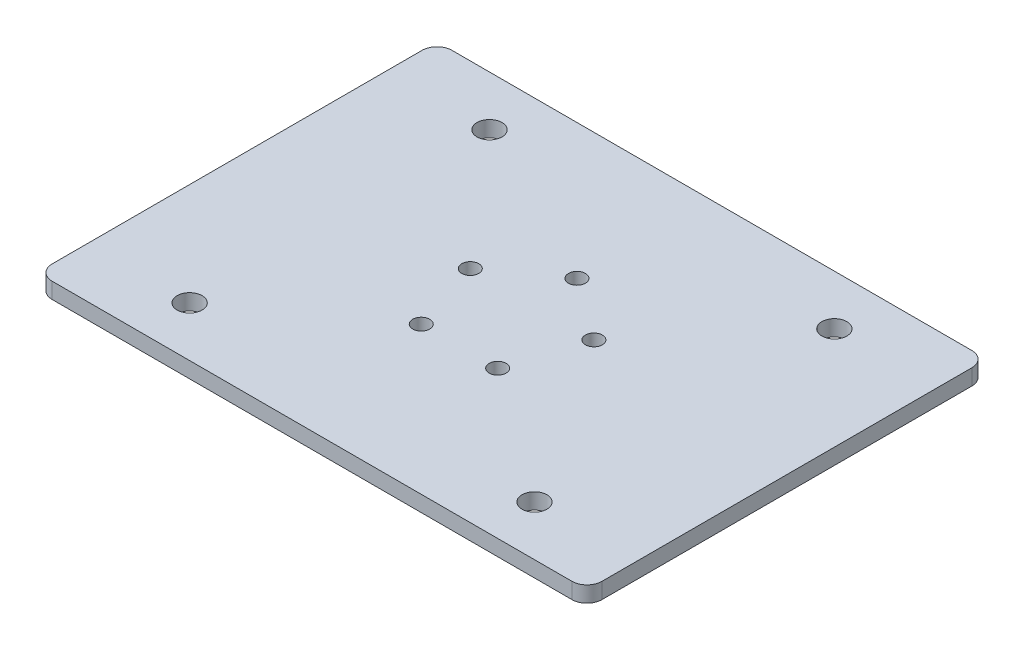
ISO-10303-21;
HEADER;
FILE_DESCRIPTION(('STEP AP214'),'2;1');
FILE_NAME('part.step','',(''),(''),'','','');
FILE_SCHEMA(('AUTOMOTIVE_DESIGN { 1 0 10303 214 1 1 1 1 }'));
ENDSEC;
DATA;
#1=APPLICATION_CONTEXT('core data for automotive mechanical design processes');
#2=APPLICATION_PROTOCOL_DEFINITION('international standard','automotive_design',2000,#1);
#3=PRODUCT_CONTEXT('',#1,'mechanical');
#4=PRODUCT('Part','Part','',(#3));
#5=PRODUCT_RELATED_PRODUCT_CATEGORY('part','',(#4));
#6=PRODUCT_DEFINITION_FORMATION('','',#4);
#7=PRODUCT_DEFINITION_CONTEXT('part definition',#1,'design');
#8=PRODUCT_DEFINITION('design','',#6,#7);
#9=PRODUCT_DEFINITION_SHAPE('','',#8);
#10=(LENGTH_UNIT() NAMED_UNIT(*) SI_UNIT(.MILLI.,.METRE.));
#11=(NAMED_UNIT(*) PLANE_ANGLE_UNIT() SI_UNIT($,.RADIAN.));
#12=(NAMED_UNIT(*) SI_UNIT($,.STERADIAN.) SOLID_ANGLE_UNIT());
#13=UNCERTAINTY_MEASURE_WITH_UNIT(LENGTH_MEASURE(1.E-05),#10,'distance_accuracy_value','');
#14=(GEOMETRIC_REPRESENTATION_CONTEXT(3) GLOBAL_UNCERTAINTY_ASSIGNED_CONTEXT((#13)) GLOBAL_UNIT_ASSIGNED_CONTEXT((#10,
#11,#12)) REPRESENTATION_CONTEXT('',''));
#15=CARTESIAN_POINT('',(0.,0.,0.));
#16=DIRECTION('',(0.,0.,1.));
#17=DIRECTION('',(1.,0.,0.));
#18=AXIS2_PLACEMENT_3D('',#15,#16,#17);
#19=CARTESIAN_POINT('',(52.,1.5875,-37.));
#20=DIRECTION('',(0.,-1.,0.));
#21=DIRECTION('',(0.,0.,-1.));
#22=AXIS2_PLACEMENT_3D('',#19,#20,#21);
#23=PLANE('',#22);
#24=CARTESIAN_POINT('',(0.,1.5875,-13.));
#25=DIRECTION('',(0.,1.,0.));
#26=DIRECTION('',(0.,0.,1.));
#27=AXIS2_PLACEMENT_3D('',#24,#25,#26);
#28=CIRCLE('',#27,1.7);
#29=CARTESIAN_POINT('',(0.,1.5875,-11.3));
#30=VERTEX_POINT('',#29);
#31=EDGE_CURVE('E186',#30,#30,#28,.T.);
#32=ORIENTED_EDGE('',*,*,#31,.F.);
#33=EDGE_LOOP('',(#32));
#34=FACE_BOUND('',#33,.T.);
#35=CARTESIAN_POINT('',(12.363734711837,1.5875,-4.01722092687432));
#36=DIRECTION('',(0.,1.,0.));
#37=DIRECTION('',(0.,0.,1.));
#38=AXIS2_PLACEMENT_3D('',#35,#36,#37);
#39=CIRCLE('',#38,1.7);
#40=CARTESIAN_POINT('',(12.363734711837,1.5875,-2.31722092687432));
#41=VERTEX_POINT('',#40);
#42=EDGE_CURVE('E176',#41,#41,#39,.T.);
#43=ORIENTED_EDGE('',*,*,#42,.F.);
#44=EDGE_LOOP('',(#43));
#45=FACE_BOUND('',#44,.T.);
#46=CARTESIAN_POINT('',(7.64120827980215,1.5875,10.5172209268743));
#47=DIRECTION('',(0.,1.,0.));
#48=DIRECTION('',(0.,0.,1.));
#49=AXIS2_PLACEMENT_3D('',#46,#47,#48);
#50=CIRCLE('',#49,1.7);
#51=CARTESIAN_POINT('',(7.64120827980215,1.5875,12.2172209268743));
#52=VERTEX_POINT('',#51);
#53=EDGE_CURVE('E173',#52,#52,#50,.T.);
#54=ORIENTED_EDGE('',*,*,#53,.F.);
#55=EDGE_LOOP('',(#54));
#56=FACE_BOUND('',#55,.T.);
#57=CARTESIAN_POINT('',(-7.64120827980215,1.5875,10.5172209268743));
#58=DIRECTION('',(0.,1.,0.));
#59=DIRECTION('',(0.,0.,1.));
#60=AXIS2_PLACEMENT_3D('',#57,#58,#59);
#61=CIRCLE('',#60,1.7);
#62=CARTESIAN_POINT('',(-7.64120827980215,1.5875,12.2172209268743));
#63=VERTEX_POINT('',#62);
#64=EDGE_CURVE('E172',#63,#63,#61,.T.);
#65=ORIENTED_EDGE('',*,*,#64,.F.);
#66=EDGE_LOOP('',(#65));
#67=FACE_BOUND('',#66,.T.);
#68=CARTESIAN_POINT('',(-12.363734711837,1.5875,-4.01722092687432));
#69=DIRECTION('',(0.,1.,0.));
#70=DIRECTION('',(0.,0.,1.));
#71=AXIS2_PLACEMENT_3D('',#68,#69,#70);
#72=CIRCLE('',#71,1.7);
#73=CARTESIAN_POINT('',(-12.363734711837,1.5875,-2.31722092687432));
#74=VERTEX_POINT('',#73);
#75=EDGE_CURVE('E169',#74,#74,#72,.T.);
#76=ORIENTED_EDGE('',*,*,#75,.F.);
#77=EDGE_LOOP('',(#76));
#78=FACE_BOUND('',#77,.T.);
#79=CARTESIAN_POINT('',(-34.5,1.5875,30.));
#80=DIRECTION('',(0.,1.,0.));
#81=DIRECTION('',(0.,0.,1.));
#82=AXIS2_PLACEMENT_3D('',#79,#80,#81);
#83=CIRCLE('',#82,2.5);
#84=CARTESIAN_POINT('',(-34.5,1.5875,32.5));
#85=VERTEX_POINT('',#84);
#86=EDGE_CURVE('E202',#85,#85,#83,.T.);
#87=ORIENTED_EDGE('',*,*,#86,.F.);
#88=EDGE_LOOP('',(#87));
#89=FACE_BOUND('',#88,.T.);
#90=CARTESIAN_POINT('',(34.5,1.5875,-30.));
#91=DIRECTION('',(0.,1.,0.));
#92=DIRECTION('',(0.,0.,1.));
#93=AXIS2_PLACEMENT_3D('',#90,#91,#92);
#94=CIRCLE('',#93,2.49999999999999);
#95=CARTESIAN_POINT('',(34.5,1.5875,-27.5));
#96=VERTEX_POINT('',#95);
#97=EDGE_CURVE('E142',#96,#96,#94,.T.);
#98=ORIENTED_EDGE('',*,*,#97,.F.);
#99=EDGE_LOOP('',(#98));
#100=FACE_BOUND('',#99,.T.);
#101=CARTESIAN_POINT('',(52.,1.5875,-37.));
#102=DIRECTION('',(0.,1.,0.));
#103=DIRECTION('',(0.,0.,-1.));
#104=AXIS2_PLACEMENT_3D('',#101,#102,#103);
#105=CIRCLE('',#104,3.);
#106=CARTESIAN_POINT('',(55.,1.5875,-37.));
#107=VERTEX_POINT('',#106);
#108=CARTESIAN_POINT('',(52.,1.5875,-40.));
#109=VERTEX_POINT('',#108);
#110=EDGE_CURVE('E153',#107,#109,#105,.T.);
#111=ORIENTED_EDGE('',*,*,#110,.T.);
#112=DIRECTION('',(-1.,0.,0.));
#113=VECTOR('',#112,1.);
#114=CARTESIAN_POINT('',(52.,1.5875,-40.));
#115=LINE('',#114,#113);
#116=CARTESIAN_POINT('',(-52.,1.5875,-40.));
#117=VERTEX_POINT('',#116);
#118=EDGE_CURVE('E101',#109,#117,#115,.T.);
#119=ORIENTED_EDGE('',*,*,#118,.T.);
#120=CARTESIAN_POINT('',(-52.,1.5875,-37.));
#121=DIRECTION('',(0.,1.,0.));
#122=DIRECTION('',(0.,0.,1.));
#123=AXIS2_PLACEMENT_3D('',#120,#121,#122);
#124=CIRCLE('',#123,3.00000000000001);
#125=CARTESIAN_POINT('',(-55.,1.5875,-37.));
#126=VERTEX_POINT('',#125);
#127=EDGE_CURVE('E220',#117,#126,#124,.T.);
#128=ORIENTED_EDGE('',*,*,#127,.T.);
#129=DIRECTION('',(0.,0.,1.));
#130=VECTOR('',#129,1.);
#131=CARTESIAN_POINT('',(-55.,1.5875,-37.));
#132=LINE('',#131,#130);
#133=CARTESIAN_POINT('',(-55.,1.5875,37.));
#134=VERTEX_POINT('',#133);
#135=EDGE_CURVE('E222',#126,#134,#132,.T.);
#136=ORIENTED_EDGE('',*,*,#135,.T.);
#137=CARTESIAN_POINT('',(-52.,1.5875,37.));
#138=DIRECTION('',(0.,1.,0.));
#139=DIRECTION('',(0.,0.,-1.));
#140=AXIS2_PLACEMENT_3D('',#137,#138,#139);
#141=CIRCLE('',#140,3.);
#142=CARTESIAN_POINT('',(-52.,1.5875,40.));
#143=VERTEX_POINT('',#142);
#144=EDGE_CURVE('E120',#134,#143,#141,.T.);
#145=ORIENTED_EDGE('',*,*,#144,.T.);
#146=DIRECTION('',(1.,0.,0.));
#147=VECTOR('',#146,1.);
#148=CARTESIAN_POINT('',(52.,1.5875,40.));
#149=LINE('',#148,#147);
#150=CARTESIAN_POINT('',(52.,1.5875,40.));
#151=VERTEX_POINT('',#150);
#152=EDGE_CURVE('E114',#143,#151,#149,.T.);
#153=ORIENTED_EDGE('',*,*,#152,.T.);
#154=CARTESIAN_POINT('',(52.,1.5875,37.));
#155=DIRECTION('',(0.,1.,0.));
#156=DIRECTION('',(0.,0.,-1.));
#157=AXIS2_PLACEMENT_3D('',#154,#155,#156);
#158=CIRCLE('',#157,3.00000000000001);
#159=CARTESIAN_POINT('',(55.,1.5875,37.));
#160=VERTEX_POINT('',#159);
#161=EDGE_CURVE('E118',#151,#160,#158,.T.);
#162=ORIENTED_EDGE('',*,*,#161,.T.);
#163=DIRECTION('',(0.,0.,-1.));
#164=VECTOR('',#163,1.);
#165=CARTESIAN_POINT('',(55.,1.5875,-37.));
#166=LINE('',#165,#164);
#167=EDGE_CURVE('E58',#160,#107,#166,.T.);
#168=ORIENTED_EDGE('',*,*,#167,.T.);
#169=EDGE_LOOP('',(#111,#119,#128,#136,#145,#153,#162,#168));
#170=FACE_BOUND('',#169,.T.);
#171=CARTESIAN_POINT('',(34.5,1.5875,30.));
#172=DIRECTION('',(0.,1.,0.));
#173=DIRECTION('',(0.,0.,1.));
#174=AXIS2_PLACEMENT_3D('',#171,#172,#173);
#175=CIRCLE('',#174,2.50000000000001);
#176=CARTESIAN_POINT('',(34.5,1.5875,32.5));
#177=VERTEX_POINT('',#176);
#178=EDGE_CURVE('E208',#177,#177,#175,.T.);
#179=ORIENTED_EDGE('',*,*,#178,.F.);
#180=EDGE_LOOP('',(#179));
#181=FACE_BOUND('',#180,.T.);
#182=CARTESIAN_POINT('',(-34.5,1.5875,-30.));
#183=DIRECTION('',(0.,1.,0.));
#184=DIRECTION('',(0.,0.,1.));
#185=AXIS2_PLACEMENT_3D('',#182,#183,#184);
#186=CIRCLE('',#185,2.5);
#187=CARTESIAN_POINT('',(-34.5,1.5875,-27.5));
#188=VERTEX_POINT('',#187);
#189=EDGE_CURVE('E196',#188,#188,#186,.T.);
#190=ORIENTED_EDGE('',*,*,#189,.F.);
#191=EDGE_LOOP('',(#190));
#192=FACE_BOUND('',#191,.T.);
#193=ADVANCED_FACE('F39',(#34,#45,#56,#67,#78,#89,#100,#170,#181,#192),#23,.F.);
#194=CARTESIAN_POINT('',(52.,-1.5875,-37.));
#195=DIRECTION('',(0.,-1.,0.));
#196=DIRECTION('',(0.,0.,-1.));
#197=AXIS2_PLACEMENT_3D('',#194,#195,#196);
#198=PLANE('',#197);
#199=CARTESIAN_POINT('',(0.,-1.5875,-13.));
#200=DIRECTION('',(0.,-1.,0.));
#201=DIRECTION('',(0.,0.,-1.));
#202=AXIS2_PLACEMENT_3D('',#199,#200,#201);
#203=CIRCLE('',#202,1.7);
#204=CARTESIAN_POINT('',(0.,-1.5875,-14.7));
#205=VERTEX_POINT('',#204);
#206=EDGE_CURVE('E43',#205,#205,#203,.T.);
#207=ORIENTED_EDGE('',*,*,#206,.F.);
#208=EDGE_LOOP('',(#207));
#209=FACE_BOUND('',#208,.T.);
#210=CARTESIAN_POINT('',(12.363734711837,-1.5875,-4.01722092687432));
#211=DIRECTION('',(0.,-1.,0.));
#212=DIRECTION('',(0.,0.,-1.));
#213=AXIS2_PLACEMENT_3D('',#210,#211,#212);
#214=CIRCLE('',#213,1.7);
#215=CARTESIAN_POINT('',(12.363734711837,-1.5875,-5.71722092687431));
#216=VERTEX_POINT('',#215);
#217=EDGE_CURVE('E174',#216,#216,#214,.T.);
#218=ORIENTED_EDGE('',*,*,#217,.F.);
#219=EDGE_LOOP('',(#218));
#220=FACE_BOUND('',#219,.T.);
#221=CARTESIAN_POINT('',(7.64120827980215,-1.5875,10.5172209268743));
#222=DIRECTION('',(0.,-1.,0.));
#223=DIRECTION('',(0.,0.,-1.));
#224=AXIS2_PLACEMENT_3D('',#221,#222,#223);
#225=CIRCLE('',#224,1.7);
#226=CARTESIAN_POINT('',(7.64120827980215,-1.5875,8.81722092687432));
#227=VERTEX_POINT('',#226);
#228=EDGE_CURVE('E170',#227,#227,#225,.T.);
#229=ORIENTED_EDGE('',*,*,#228,.F.);
#230=EDGE_LOOP('',(#229));
#231=FACE_BOUND('',#230,.T.);
#232=CARTESIAN_POINT('',(-7.64120827980215,-1.5875,10.5172209268743));
#233=DIRECTION('',(0.,-1.,0.));
#234=DIRECTION('',(0.,0.,-1.));
#235=AXIS2_PLACEMENT_3D('',#232,#233,#234);
#236=CIRCLE('',#235,1.7);
#237=CARTESIAN_POINT('',(-7.64120827980215,-1.5875,8.81722092687432));
#238=VERTEX_POINT('',#237);
#239=EDGE_CURVE('E191',#238,#238,#236,.T.);
#240=ORIENTED_EDGE('',*,*,#239,.F.);
#241=EDGE_LOOP('',(#240));
#242=FACE_BOUND('',#241,.T.);
#243=CARTESIAN_POINT('',(-12.363734711837,-1.5875,-4.01722092687432));
#244=DIRECTION('',(0.,-1.,0.));
#245=DIRECTION('',(0.,0.,-1.));
#246=AXIS2_PLACEMENT_3D('',#243,#244,#245);
#247=CIRCLE('',#246,1.7);
#248=CARTESIAN_POINT('',(-12.363734711837,-1.5875,-5.71722092687432));
#249=VERTEX_POINT('',#248);
#250=EDGE_CURVE('E165',#249,#249,#247,.T.);
#251=ORIENTED_EDGE('',*,*,#250,.F.);
#252=EDGE_LOOP('',(#251));
#253=FACE_BOUND('',#252,.T.);
#254=CARTESIAN_POINT('',(-34.5,-1.5875,30.));
#255=DIRECTION('',(0.,1.,0.));
#256=DIRECTION('',(0.,0.,1.));
#257=AXIS2_PLACEMENT_3D('',#254,#255,#256);
#258=CIRCLE('',#257,2.5);
#259=CARTESIAN_POINT('',(-34.5,-1.5875,32.5));
#260=VERTEX_POINT('',#259);
#261=EDGE_CURVE('E199',#260,#260,#258,.T.);
#262=ORIENTED_EDGE('',*,*,#261,.T.);
#263=EDGE_LOOP('',(#262));
#264=FACE_BOUND('',#263,.T.);
#265=CARTESIAN_POINT('',(34.5,-1.5875,-30.));
#266=DIRECTION('',(0.,1.,0.));
#267=DIRECTION('',(0.,0.,1.));
#268=AXIS2_PLACEMENT_3D('',#265,#266,#267);
#269=CIRCLE('',#268,2.49999999999999);
#270=CARTESIAN_POINT('',(34.5,-1.5875,-27.5));
#271=VERTEX_POINT('',#270);
#272=EDGE_CURVE('E211',#271,#271,#269,.T.);
#273=ORIENTED_EDGE('',*,*,#272,.T.);
#274=EDGE_LOOP('',(#273));
#275=FACE_BOUND('',#274,.T.);
#276=CARTESIAN_POINT('',(52.,-1.5875,-37.));
#277=DIRECTION('',(0.,1.,0.));
#278=DIRECTION('',(0.,0.,-1.));
#279=AXIS2_PLACEMENT_3D('',#276,#277,#278);
#280=CIRCLE('',#279,3.);
#281=CARTESIAN_POINT('',(55.,-1.5875,-37.));
#282=VERTEX_POINT('',#281);
#283=CARTESIAN_POINT('',(52.,-1.5875,-40.));
#284=VERTEX_POINT('',#283);
#285=EDGE_CURVE('E138',#282,#284,#280,.T.);
#286=ORIENTED_EDGE('',*,*,#285,.F.);
#287=DIRECTION('',(0.,0.,-1.));
#288=VECTOR('',#287,1.);
#289=CARTESIAN_POINT('',(55.,-1.5875,-37.));
#290=LINE('',#289,#288);
#291=CARTESIAN_POINT('',(55.,-1.5875,37.));
#292=VERTEX_POINT('',#291);
#293=EDGE_CURVE('E93',#292,#282,#290,.T.);
#294=ORIENTED_EDGE('',*,*,#293,.F.);
#295=CARTESIAN_POINT('',(52.,-1.5875,37.));
#296=DIRECTION('',(0.,1.,0.));
#297=DIRECTION('',(0.,0.,-1.));
#298=AXIS2_PLACEMENT_3D('',#295,#296,#297);
#299=CIRCLE('',#298,3.00000000000001);
#300=CARTESIAN_POINT('',(52.,-1.5875,40.));
#301=VERTEX_POINT('',#300);
#302=EDGE_CURVE('E87',#301,#292,#299,.T.);
#303=ORIENTED_EDGE('',*,*,#302,.F.);
#304=DIRECTION('',(1.,0.,0.));
#305=VECTOR('',#304,1.);
#306=CARTESIAN_POINT('',(52.,-1.5875,40.));
#307=LINE('',#306,#305);
#308=CARTESIAN_POINT('',(-52.,-1.5875,40.));
#309=VERTEX_POINT('',#308);
#310=EDGE_CURVE('E128',#309,#301,#307,.T.);
#311=ORIENTED_EDGE('',*,*,#310,.F.);
#312=CARTESIAN_POINT('',(-52.,-1.5875,37.));
#313=DIRECTION('',(0.,1.,0.));
#314=DIRECTION('',(0.,0.,-1.));
#315=AXIS2_PLACEMENT_3D('',#312,#313,#314);
#316=CIRCLE('',#315,3.);
#317=CARTESIAN_POINT('',(-55.,-1.5875,37.));
#318=VERTEX_POINT('',#317);
#319=EDGE_CURVE('E148',#318,#309,#316,.T.);
#320=ORIENTED_EDGE('',*,*,#319,.F.);
#321=DIRECTION('',(0.,0.,1.));
#322=VECTOR('',#321,1.);
#323=CARTESIAN_POINT('',(-55.,-1.5875,-37.));
#324=LINE('',#323,#322);
#325=CARTESIAN_POINT('',(-55.,-1.5875,-37.));
#326=VERTEX_POINT('',#325);
#327=EDGE_CURVE('E146',#326,#318,#324,.T.);
#328=ORIENTED_EDGE('',*,*,#327,.F.);
#329=CARTESIAN_POINT('',(-52.,-1.5875,-37.));
#330=DIRECTION('',(0.,1.,0.));
#331=DIRECTION('',(0.,0.,1.));
#332=AXIS2_PLACEMENT_3D('',#329,#330,#331);
#333=CIRCLE('',#332,3.00000000000001);
#334=CARTESIAN_POINT('',(-52.,-1.5875,-40.));
#335=VERTEX_POINT('',#334);
#336=EDGE_CURVE('E144',#335,#326,#333,.T.);
#337=ORIENTED_EDGE('',*,*,#336,.F.);
#338=DIRECTION('',(-1.,0.,0.));
#339=VECTOR('',#338,1.);
#340=CARTESIAN_POINT('',(52.,-1.5875,-40.));
#341=LINE('',#340,#339);
#342=EDGE_CURVE('E141',#284,#335,#341,.T.);
#343=ORIENTED_EDGE('',*,*,#342,.F.);
#344=EDGE_LOOP('',(#286,#294,#303,#311,#320,#328,#337,#343));
#345=FACE_BOUND('',#344,.T.);
#346=CARTESIAN_POINT('',(34.5,-1.5875,30.));
#347=DIRECTION('',(0.,1.,0.));
#348=DIRECTION('',(0.,0.,1.));
#349=AXIS2_PLACEMENT_3D('',#346,#347,#348);
#350=CIRCLE('',#349,2.50000000000001);
#351=CARTESIAN_POINT('',(34.5,-1.5875,32.5));
#352=VERTEX_POINT('',#351);
#353=EDGE_CURVE('E205',#352,#352,#350,.T.);
#354=ORIENTED_EDGE('',*,*,#353,.T.);
#355=EDGE_LOOP('',(#354));
#356=FACE_BOUND('',#355,.T.);
#357=CARTESIAN_POINT('',(-34.5,-1.5875,-30.));
#358=DIRECTION('',(0.,1.,0.));
#359=DIRECTION('',(0.,0.,1.));
#360=AXIS2_PLACEMENT_3D('',#357,#358,#359);
#361=CIRCLE('',#360,2.5);
#362=CARTESIAN_POINT('',(-34.5,-1.5875,-27.5));
#363=VERTEX_POINT('',#362);
#364=EDGE_CURVE('E168',#363,#363,#361,.T.);
#365=ORIENTED_EDGE('',*,*,#364,.T.);
#366=EDGE_LOOP('',(#365));
#367=FACE_BOUND('',#366,.T.);
#368=ADVANCED_FACE('F235',(#209,#220,#231,#242,#253,#264,#275,#345,#356,#367),#198,.T.);
#369=CARTESIAN_POINT('',(52.,1.5875,-37.));
#370=DIRECTION('',(0.,-1.,0.));
#371=DIRECTION('',(0.,0.,-1.));
#372=AXIS2_PLACEMENT_3D('',#369,#370,#371);
#373=CYLINDRICAL_SURFACE('',#372,3.);
#374=ORIENTED_EDGE('',*,*,#285,.T.);
#375=DIRECTION('',(0.,-1.,0.));
#376=VECTOR('',#375,1.);
#377=CARTESIAN_POINT('',(52.,1.5875,-40.));
#378=LINE('',#377,#376);
#379=EDGE_CURVE('E11',#109,#284,#378,.T.);
#380=ORIENTED_EDGE('',*,*,#379,.F.);
#381=ORIENTED_EDGE('',*,*,#110,.F.);
#382=DIRECTION('',(0.,-1.,0.));
#383=VECTOR('',#382,1.);
#384=CARTESIAN_POINT('',(55.,1.5875,-37.));
#385=LINE('',#384,#383);
#386=EDGE_CURVE('E134',#107,#282,#385,.T.);
#387=ORIENTED_EDGE('',*,*,#386,.T.);
#388=EDGE_LOOP('',(#374,#380,#381,#387));
#389=FACE_BOUND('',#388,.T.);
#390=ADVANCED_FACE('F41',(#389),#373,.T.);
#391=CARTESIAN_POINT('',(52.,1.5875,-40.));
#392=DIRECTION('',(0.,0.,1.));
#393=DIRECTION('',(1.,0.,0.));
#394=AXIS2_PLACEMENT_3D('',#391,#392,#393);
#395=PLANE('',#394);
#396=ORIENTED_EDGE('',*,*,#342,.T.);
#397=DIRECTION('',(0.,-1.,0.));
#398=VECTOR('',#397,1.);
#399=CARTESIAN_POINT('',(-52.,1.5875,-40.));
#400=LINE('',#399,#398);
#401=EDGE_CURVE('E49',#117,#335,#400,.T.);
#402=ORIENTED_EDGE('',*,*,#401,.F.);
#403=ORIENTED_EDGE('',*,*,#118,.F.);
#404=ORIENTED_EDGE('',*,*,#379,.T.);
#405=EDGE_LOOP('',(#396,#402,#403,#404));
#406=FACE_BOUND('',#405,.T.);
#407=ADVANCED_FACE('F354',(#406),#395,.F.);
#408=CARTESIAN_POINT('',(-52.,1.5875,-37.));
#409=DIRECTION('',(0.,-1.,0.));
#410=DIRECTION('',(0.,0.,-1.));
#411=AXIS2_PLACEMENT_3D('',#408,#409,#410);
#412=CYLINDRICAL_SURFACE('',#411,3.00000000000001);
#413=ORIENTED_EDGE('',*,*,#336,.T.);
#414=DIRECTION('',(0.,-1.,0.));
#415=VECTOR('',#414,1.);
#416=CARTESIAN_POINT('',(-55.,1.5875,-37.));
#417=LINE('',#416,#415);
#418=EDGE_CURVE('E160',#126,#326,#417,.T.);
#419=ORIENTED_EDGE('',*,*,#418,.F.);
#420=ORIENTED_EDGE('',*,*,#127,.F.);
#421=ORIENTED_EDGE('',*,*,#401,.T.);
#422=EDGE_LOOP('',(#413,#419,#420,#421));
#423=FACE_BOUND('',#422,.T.);
#424=ADVANCED_FACE('F360',(#423),#412,.T.);
#425=CARTESIAN_POINT('',(-55.,1.5875,-37.));
#426=DIRECTION('',(1.,0.,0.));
#427=DIRECTION('',(0.,0.,-1.));
#428=AXIS2_PLACEMENT_3D('',#425,#426,#427);
#429=PLANE('',#428);
#430=ORIENTED_EDGE('',*,*,#327,.T.);
#431=DIRECTION('',(0.,-1.,0.));
#432=VECTOR('',#431,1.);
#433=CARTESIAN_POINT('',(-55.,1.5875,37.));
#434=LINE('',#433,#432);
#435=EDGE_CURVE('E157',#134,#318,#434,.T.);
#436=ORIENTED_EDGE('',*,*,#435,.F.);
#437=ORIENTED_EDGE('',*,*,#135,.F.);
#438=ORIENTED_EDGE('',*,*,#418,.T.);
#439=EDGE_LOOP('',(#430,#436,#437,#438));
#440=FACE_BOUND('',#439,.T.);
#441=ADVANCED_FACE('F228',(#440),#429,.F.);
#442=CARTESIAN_POINT('',(-52.,1.5875,37.));
#443=DIRECTION('',(0.,-1.,0.));
#444=DIRECTION('',(0.,0.,-1.));
#445=AXIS2_PLACEMENT_3D('',#442,#443,#444);
#446=CYLINDRICAL_SURFACE('',#445,3.);
#447=ORIENTED_EDGE('',*,*,#319,.T.);
#448=DIRECTION('',(0.,-1.,0.));
#449=VECTOR('',#448,1.);
#450=CARTESIAN_POINT('',(-52.,1.5875,40.));
#451=LINE('',#450,#449);
#452=EDGE_CURVE('E129',#143,#309,#451,.T.);
#453=ORIENTED_EDGE('',*,*,#452,.F.);
#454=ORIENTED_EDGE('',*,*,#144,.F.);
#455=ORIENTED_EDGE('',*,*,#435,.T.);
#456=EDGE_LOOP('',(#447,#453,#454,#455));
#457=FACE_BOUND('',#456,.T.);
#458=ADVANCED_FACE('F232',(#457),#446,.T.);
#459=CARTESIAN_POINT('',(52.,1.5875,40.));
#460=DIRECTION('',(0.,0.,-1.));
#461=DIRECTION('',(-1.,0.,0.));
#462=AXIS2_PLACEMENT_3D('',#459,#460,#461);
#463=PLANE('',#462);
#464=ORIENTED_EDGE('',*,*,#310,.T.);
#465=DIRECTION('',(0.,-1.,0.));
#466=VECTOR('',#465,1.);
#467=CARTESIAN_POINT('',(52.,1.5875,40.));
#468=LINE('',#467,#466);
#469=EDGE_CURVE('E125',#151,#301,#468,.T.);
#470=ORIENTED_EDGE('',*,*,#469,.F.);
#471=ORIENTED_EDGE('',*,*,#152,.F.);
#472=ORIENTED_EDGE('',*,*,#452,.T.);
#473=EDGE_LOOP('',(#464,#470,#471,#472));
#474=FACE_BOUND('',#473,.T.);
#475=ADVANCED_FACE('F126',(#474),#463,.F.);
#476=CARTESIAN_POINT('',(52.,1.5875,37.));
#477=DIRECTION('',(0.,-1.,0.));
#478=DIRECTION('',(0.,0.,-1.));
#479=AXIS2_PLACEMENT_3D('',#476,#477,#478);
#480=CYLINDRICAL_SURFACE('',#479,3.00000000000001);
#481=ORIENTED_EDGE('',*,*,#302,.T.);
#482=DIRECTION('',(0.,-1.,0.));
#483=VECTOR('',#482,1.);
#484=CARTESIAN_POINT('',(55.,1.5875,37.));
#485=LINE('',#484,#483);
#486=EDGE_CURVE('E130',#160,#292,#485,.T.);
#487=ORIENTED_EDGE('',*,*,#486,.F.);
#488=ORIENTED_EDGE('',*,*,#161,.F.);
#489=ORIENTED_EDGE('',*,*,#469,.T.);
#490=EDGE_LOOP('',(#481,#487,#488,#489));
#491=FACE_BOUND('',#490,.T.);
#492=ADVANCED_FACE('F132',(#491),#480,.T.);
#493=CARTESIAN_POINT('',(55.,1.5875,-37.));
#494=DIRECTION('',(-1.,0.,0.));
#495=DIRECTION('',(0.,0.,1.));
#496=AXIS2_PLACEMENT_3D('',#493,#494,#495);
#497=PLANE('',#496);
#498=ORIENTED_EDGE('',*,*,#293,.T.);
#499=ORIENTED_EDGE('',*,*,#386,.F.);
#500=ORIENTED_EDGE('',*,*,#167,.F.);
#501=ORIENTED_EDGE('',*,*,#486,.T.);
#502=EDGE_LOOP('',(#498,#499,#500,#501));
#503=FACE_BOUND('',#502,.T.);
#504=ADVANCED_FACE('F241',(#503),#497,.F.);
#505=CARTESIAN_POINT('',(34.5,1.5875,-30.));
#506=DIRECTION('',(0.,-1.,0.));
#507=DIRECTION('',(0.,0.,-1.));
#508=AXIS2_PLACEMENT_3D('',#505,#506,#507);
#509=CYLINDRICAL_SURFACE('',#508,2.49999999999999);
#510=ORIENTED_EDGE('',*,*,#97,.T.);
#511=EDGE_LOOP('',(#510));
#512=FACE_BOUND('',#511,.T.);
#513=ORIENTED_EDGE('',*,*,#272,.F.);
#514=EDGE_LOOP('',(#513));
#515=FACE_BOUND('',#514,.T.);
#516=ADVANCED_FACE('F243',(#512,#515),#509,.F.);
#517=CARTESIAN_POINT('',(34.5,1.5875,30.));
#518=DIRECTION('',(0.,-1.,0.));
#519=DIRECTION('',(0.,0.,-1.));
#520=AXIS2_PLACEMENT_3D('',#517,#518,#519);
#521=CYLINDRICAL_SURFACE('',#520,2.50000000000001);
#522=ORIENTED_EDGE('',*,*,#178,.T.);
#523=EDGE_LOOP('',(#522));
#524=FACE_BOUND('',#523,.T.);
#525=ORIENTED_EDGE('',*,*,#353,.F.);
#526=EDGE_LOOP('',(#525));
#527=FACE_BOUND('',#526,.T.);
#528=ADVANCED_FACE('F249',(#524,#527),#521,.F.);
#529=CARTESIAN_POINT('',(-34.5,1.5875,30.));
#530=DIRECTION('',(0.,-1.,0.));
#531=DIRECTION('',(0.,0.,-1.));
#532=AXIS2_PLACEMENT_3D('',#529,#530,#531);
#533=CYLINDRICAL_SURFACE('',#532,2.5);
#534=ORIENTED_EDGE('',*,*,#86,.T.);
#535=EDGE_LOOP('',(#534));
#536=FACE_BOUND('',#535,.T.);
#537=ORIENTED_EDGE('',*,*,#261,.F.);
#538=EDGE_LOOP('',(#537));
#539=FACE_BOUND('',#538,.T.);
#540=ADVANCED_FACE('F267',(#536,#539),#533,.F.);
#541=CARTESIAN_POINT('',(-34.5,1.5875,-30.));
#542=DIRECTION('',(0.,-1.,0.));
#543=DIRECTION('',(0.,0.,-1.));
#544=AXIS2_PLACEMENT_3D('',#541,#542,#543);
#545=CYLINDRICAL_SURFACE('',#544,2.5);
#546=ORIENTED_EDGE('',*,*,#189,.T.);
#547=EDGE_LOOP('',(#546));
#548=FACE_BOUND('',#547,.T.);
#549=ORIENTED_EDGE('',*,*,#364,.F.);
#550=EDGE_LOOP('',(#549));
#551=FACE_BOUND('',#550,.T.);
#552=ADVANCED_FACE('F271',(#548,#551),#545,.F.);
#553=CARTESIAN_POINT('',(-12.363734711837,1.5875,-4.01722092687432));
#554=DIRECTION('',(0.,1.,0.));
#555=DIRECTION('',(0.,0.,1.));
#556=AXIS2_PLACEMENT_3D('',#553,#554,#555);
#557=CYLINDRICAL_SURFACE('',#556,1.7);
#558=ORIENTED_EDGE('',*,*,#250,.T.);
#559=EDGE_LOOP('',(#558));
#560=FACE_BOUND('',#559,.T.);
#561=ORIENTED_EDGE('',*,*,#75,.T.);
#562=EDGE_LOOP('',(#561));
#563=FACE_BOUND('',#562,.T.);
#564=ADVANCED_FACE('F274',(#560,#563),#557,.F.);
#565=CARTESIAN_POINT('',(-7.64120827980215,1.5875,10.5172209268743));
#566=DIRECTION('',(0.,1.,0.));
#567=DIRECTION('',(0.,0.,1.));
#568=AXIS2_PLACEMENT_3D('',#565,#566,#567);
#569=CYLINDRICAL_SURFACE('',#568,1.7);
#570=ORIENTED_EDGE('',*,*,#239,.T.);
#571=EDGE_LOOP('',(#570));
#572=FACE_BOUND('',#571,.T.);
#573=ORIENTED_EDGE('',*,*,#64,.T.);
#574=EDGE_LOOP('',(#573));
#575=FACE_BOUND('',#574,.T.);
#576=ADVANCED_FACE('F278',(#572,#575),#569,.F.);
#577=CARTESIAN_POINT('',(7.64120827980215,1.5875,10.5172209268743));
#578=DIRECTION('',(0.,1.,0.));
#579=DIRECTION('',(0.,0.,1.));
#580=AXIS2_PLACEMENT_3D('',#577,#578,#579);
#581=CYLINDRICAL_SURFACE('',#580,1.7);
#582=ORIENTED_EDGE('',*,*,#228,.T.);
#583=EDGE_LOOP('',(#582));
#584=FACE_BOUND('',#583,.T.);
#585=ORIENTED_EDGE('',*,*,#53,.T.);
#586=EDGE_LOOP('',(#585));
#587=FACE_BOUND('',#586,.T.);
#588=ADVANCED_FACE('F282',(#584,#587),#581,.F.);
#589=CARTESIAN_POINT('',(12.363734711837,1.5875,-4.01722092687432));
#590=DIRECTION('',(0.,1.,0.));
#591=DIRECTION('',(0.,0.,1.));
#592=AXIS2_PLACEMENT_3D('',#589,#590,#591);
#593=CYLINDRICAL_SURFACE('',#592,1.7);
#594=ORIENTED_EDGE('',*,*,#217,.T.);
#595=EDGE_LOOP('',(#594));
#596=FACE_BOUND('',#595,.T.);
#597=ORIENTED_EDGE('',*,*,#42,.T.);
#598=EDGE_LOOP('',(#597));
#599=FACE_BOUND('',#598,.T.);
#600=ADVANCED_FACE('F286',(#596,#599),#593,.F.);
#601=CARTESIAN_POINT('',(0.,1.5875,-13.));
#602=DIRECTION('',(0.,1.,0.));
#603=DIRECTION('',(0.,0.,1.));
#604=AXIS2_PLACEMENT_3D('',#601,#602,#603);
#605=CYLINDRICAL_SURFACE('',#604,1.7);
#606=ORIENTED_EDGE('',*,*,#206,.T.);
#607=EDGE_LOOP('',(#606));
#608=FACE_BOUND('',#607,.T.);
#609=ORIENTED_EDGE('',*,*,#31,.T.);
#610=EDGE_LOOP('',(#609));
#611=FACE_BOUND('',#610,.T.);
#612=ADVANCED_FACE('F290',(#608,#611),#605,.F.);
#613=CLOSED_SHELL('',(#193,#368,#390,#407,#424,#441,#458,#475,#492,#504,#516,#528,#540,#552,
#564,#576,#588,#600,#612));
#614=MANIFOLD_SOLID_BREP('B2',#613);
#615=ADVANCED_BREP_SHAPE_REPRESENTATION('',(#18,#614),#14);
#616=SHAPE_DEFINITION_REPRESENTATION(#9,#615);
ENDSEC;
END-ISO-10303-21;
